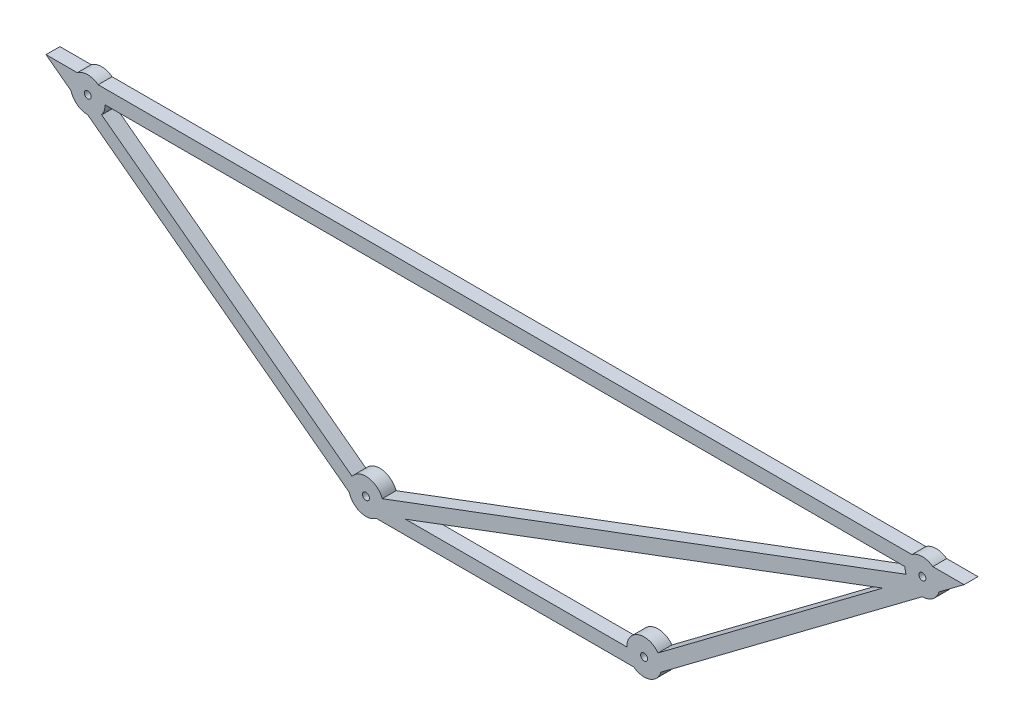
ISO-10303-21;
HEADER;
FILE_DESCRIPTION(('STEP AP214'),'2;1');
FILE_NAME('part.step','',(''),(''),'','','');
FILE_SCHEMA(('AUTOMOTIVE_DESIGN { 1 0 10303 214 1 1 1 1 }'));
ENDSEC;
DATA;
#1=APPLICATION_CONTEXT('core data for automotive mechanical design processes');
#2=APPLICATION_PROTOCOL_DEFINITION('international standard','automotive_design',2000,#1);
#3=PRODUCT_CONTEXT('',#1,'mechanical');
#4=PRODUCT('Part','Part','',(#3));
#5=PRODUCT_RELATED_PRODUCT_CATEGORY('part','',(#4));
#6=PRODUCT_DEFINITION_FORMATION('','',#4);
#7=PRODUCT_DEFINITION_CONTEXT('part definition',#1,'design');
#8=PRODUCT_DEFINITION('design','',#6,#7);
#9=PRODUCT_DEFINITION_SHAPE('','',#8);
#10=(LENGTH_UNIT() NAMED_UNIT(*) SI_UNIT(.MILLI.,.METRE.));
#11=(NAMED_UNIT(*) PLANE_ANGLE_UNIT() SI_UNIT($,.RADIAN.));
#12=(NAMED_UNIT(*) SI_UNIT($,.STERADIAN.) SOLID_ANGLE_UNIT());
#13=UNCERTAINTY_MEASURE_WITH_UNIT(LENGTH_MEASURE(1.E-05),#10,'distance_accuracy_value','');
#14=(GEOMETRIC_REPRESENTATION_CONTEXT(3) GLOBAL_UNCERTAINTY_ASSIGNED_CONTEXT((#13)) GLOBAL_UNIT_ASSIGNED_CONTEXT((#10,
#11,#12)) REPRESENTATION_CONTEXT('',''));
#15=CARTESIAN_POINT('',(0.,0.,0.));
#16=DIRECTION('',(0.,0.,1.));
#17=DIRECTION('',(1.,0.,0.));
#18=AXIS2_PLACEMENT_3D('',#15,#16,#17);
#19=CARTESIAN_POINT('',(0.,0.,0.));
#20=DIRECTION('',(0.,0.,-1.));
#21=DIRECTION('',(-1.,0.,0.));
#22=AXIS2_PLACEMENT_3D('',#19,#20,#21);
#23=PLANE('',#22);
#24=CARTESIAN_POINT('',(0.,0.,0.));
#25=DIRECTION('',(0.,0.,1.));
#26=DIRECTION('',(1.,0.,0.));
#27=AXIS2_PLACEMENT_3D('',#24,#25,#26);
#28=CIRCLE('',#27,5.);
#29=CARTESIAN_POINT('',(5.,0.,0.));
#30=VERTEX_POINT('',#29);
#31=EDGE_CURVE('E887',#30,#30,#28,.T.);
#32=ORIENTED_EDGE('',*,*,#31,.T.);
#33=EDGE_LOOP('',(#32));
#34=FACE_BOUND('',#33,.T.);
#35=CARTESIAN_POINT('',(400.,-300.,0.));
#36=DIRECTION('',(0.,0.,1.));
#37=DIRECTION('',(1.,0.,0.));
#38=AXIS2_PLACEMENT_3D('',#35,#36,#37);
#39=CIRCLE('',#38,4.99999999999999);
#40=CARTESIAN_POINT('',(405.,-300.,0.));
#41=VERTEX_POINT('',#40);
#42=EDGE_CURVE('E894',#41,#41,#39,.T.);
#43=ORIENTED_EDGE('',*,*,#42,.T.);
#44=EDGE_LOOP('',(#43));
#45=FACE_BOUND('',#44,.T.);
#46=CARTESIAN_POINT('',(800.,-300.,0.));
#47=DIRECTION('',(0.,0.,1.));
#48=DIRECTION('',(1.,0.,0.));
#49=AXIS2_PLACEMENT_3D('',#46,#47,#48);
#50=CIRCLE('',#49,5.00000000000005);
#51=CARTESIAN_POINT('',(805.,-300.,0.));
#52=VERTEX_POINT('',#51);
#53=EDGE_CURVE('E902',#52,#52,#50,.T.);
#54=ORIENTED_EDGE('',*,*,#53,.T.);
#55=EDGE_LOOP('',(#54));
#56=FACE_BOUND('',#55,.T.);
#57=CARTESIAN_POINT('',(1200.,0.,0.));
#58=DIRECTION('',(0.,0.,1.));
#59=DIRECTION('',(1.,0.,0.));
#60=AXIS2_PLACEMENT_3D('',#57,#58,#59);
#61=CIRCLE('',#60,4.99999999999982);
#62=CARTESIAN_POINT('',(1205.,0.,0.));
#63=VERTEX_POINT('',#62);
#64=EDGE_CURVE('E908',#63,#63,#61,.T.);
#65=ORIENTED_EDGE('',*,*,#64,.T.);
#66=EDGE_LOOP('',(#65));
#67=FACE_BOUND('',#66,.T.);
#68=DIRECTION('',(-1.,0.,0.));
#69=VECTOR('',#68,1.);
#70=CARTESIAN_POINT('',(0.,-300.,0.));
#71=LINE('',#70,#69);
#72=CARTESIAN_POINT('',(775.,-300.,0.));
#73=VERTEX_POINT('',#72);
#74=CARTESIAN_POINT('',(456.960024968783,-300.,0.));
#75=VERTEX_POINT('',#74);
#76=EDGE_CURVE('E650',#73,#75,#71,.T.);
#77=ORIENTED_EDGE('',*,*,#76,.F.);
#78=CARTESIAN_POINT('',(800.,-300.,0.));
#79=DIRECTION('',(0.,0.,1.));
#80=DIRECTION('',(1.,0.,0.));
#81=AXIS2_PLACEMENT_3D('',#78,#79,#80);
#82=CIRCLE('',#81,25.);
#83=CARTESIAN_POINT('',(820.,-285.,0.));
#84=VERTEX_POINT('',#83);
#85=EDGE_CURVE('E718',#84,#73,#82,.T.);
#86=ORIENTED_EDGE('',*,*,#85,.F.);
#87=DIRECTION('',(-0.799999999999999,-0.600000000000001,0.));
#88=VECTOR('',#87,1.);
#89=CARTESIAN_POINT('',(432.000000000001,-576.,0.));
#90=LINE('',#89,#88);
#91=CARTESIAN_POINT('',(1143.03997503121,-42.7200187265881,0.));
#92=VERTEX_POINT('',#91);
#93=EDGE_CURVE('E645',#92,#84,#90,.T.);
#94=ORIENTED_EDGE('',*,*,#93,.F.);
#95=DIRECTION('',(0.936329177569044,0.351123441588392,0.));
#96=VECTOR('',#95,1.);
#97=CARTESIAN_POINT('',(407.022468831768,-318.726583551381,0.));
#98=LINE('',#97,#96);
#99=EDGE_CURVE('E610',#75,#92,#98,.T.);
#100=ORIENTED_EDGE('',*,*,#99,.F.);
#101=EDGE_LOOP('',(#77,#86,#94,#100));
#102=FACE_BOUND('',#101,.T.);
#103=DIRECTION('',(-0.8,0.6,0.));
#104=VECTOR('',#103,1.);
#105=CARTESIAN_POINT('',(0.,0.,0.));
#106=LINE('',#105,#104);
#107=CARTESIAN_POINT('',(380.,-285.,0.));
#108=VERTEX_POINT('',#107);
#109=CARTESIAN_POINT('',(20.,-15.,0.));
#110=VERTEX_POINT('',#109);
#111=EDGE_CURVE('E647',#108,#110,#106,.T.);
#112=ORIENTED_EDGE('',*,*,#111,.F.);
#113=CARTESIAN_POINT('',(400.,-300.,0.));
#114=DIRECTION('',(0.,0.,1.));
#115=DIRECTION('',(1.,0.,0.));
#116=AXIS2_PLACEMENT_3D('',#113,#114,#115);
#117=CIRCLE('',#116,25.);
#118=CARTESIAN_POINT('',(423.408229439226,-291.22191396029,0.));
#119=VERTEX_POINT('',#118);
#120=EDGE_CURVE('E713',#119,#108,#117,.T.);
#121=ORIENTED_EDGE('',*,*,#120,.F.);
#122=DIRECTION('',(0.936329177569044,0.351123441588392,0.));
#123=VECTOR('',#122,1.);
#124=CARTESIAN_POINT('',(400.,-300.,0.));
#125=LINE('',#124,#123);
#126=CARTESIAN_POINT('',(1176.59177056077,-8.77808603970974,0.));
#127=VERTEX_POINT('',#126);
#128=EDGE_CURVE('E627',#119,#127,#125,.T.);
#129=ORIENTED_EDGE('',*,*,#128,.T.);
#130=CARTESIAN_POINT('',(1200.,0.,0.));
#131=DIRECTION('',(0.,0.,1.));
#132=DIRECTION('',(1.,0.,0.));
#133=AXIS2_PLACEMENT_3D('',#130,#131,#132);
#134=CIRCLE('',#133,24.9999999999998);
#135=CARTESIAN_POINT('',(1175.,0.,0.));
#136=VERTEX_POINT('',#135);
#137=EDGE_CURVE('E735',#136,#127,#134,.T.);
#138=ORIENTED_EDGE('',*,*,#137,.F.);
#139=DIRECTION('',(1.,0.,0.));
#140=VECTOR('',#139,1.);
#141=CARTESIAN_POINT('',(0.,0.,0.));
#142=LINE('',#141,#140);
#143=CARTESIAN_POINT('',(25.,0.,0.));
#144=VERTEX_POINT('',#143);
#145=EDGE_CURVE('E653',#144,#136,#142,.T.);
#146=ORIENTED_EDGE('',*,*,#145,.F.);
#147=CARTESIAN_POINT('',(0.,0.,0.));
#148=DIRECTION('',(0.,0.,1.));
#149=DIRECTION('',(1.,0.,0.));
#150=AXIS2_PLACEMENT_3D('',#147,#148,#149);
#151=CIRCLE('',#150,25.);
#152=EDGE_CURVE('E710',#110,#144,#151,.T.);
#153=ORIENTED_EDGE('',*,*,#152,.F.);
#154=EDGE_LOOP('',(#112,#121,#129,#138,#146,#153));
#155=FACE_BOUND('',#154,.T.);
#156=CARTESIAN_POINT('',(785.,-320.,0.));
#157=VERTEX_POINT('',#156);
#158=CARTESIAN_POINT('',(824.,-307.,0.));
#159=VERTEX_POINT('',#158);
#160=EDGE_CURVE('E722',#157,#159,#82,.T.);
#161=ORIENTED_EDGE('',*,*,#160,.F.);
#162=DIRECTION('',(-1.,0.,0.));
#163=VECTOR('',#162,1.);
#164=CARTESIAN_POINT('',(0.,-320.,0.));
#165=LINE('',#164,#163);
#166=CARTESIAN_POINT('',(415.,-320.,0.));
#167=VERTEX_POINT('',#166);
#168=EDGE_CURVE('E617',#157,#167,#165,.T.);
#169=ORIENTED_EDGE('',*,*,#168,.T.);
#170=CARTESIAN_POINT('',(376.,-307.,0.));
#171=VERTEX_POINT('',#170);
#172=EDGE_CURVE('E717',#171,#167,#117,.T.);
#173=ORIENTED_EDGE('',*,*,#172,.F.);
#174=DIRECTION('',(-0.8,0.6,0.));
#175=VECTOR('',#174,1.);
#176=CARTESIAN_POINT('',(-12.,-16.,0.));
#177=LINE('',#176,#175);
#178=CARTESIAN_POINT('',(0.,-25.,0.));
#179=VERTEX_POINT('',#178);
#180=EDGE_CURVE('E676',#171,#179,#177,.T.);
#181=ORIENTED_EDGE('',*,*,#180,.T.);
#182=CARTESIAN_POINT('',(-24.,-7.,0.));
#183=VERTEX_POINT('',#182);
#184=EDGE_CURVE('E709',#183,#179,#151,.T.);
#185=ORIENTED_EDGE('',*,*,#184,.F.);
#186=CARTESIAN_POINT('',(-60.,20.,0.));
#187=VERTEX_POINT('',#186);
#188=EDGE_CURVE('E677',#183,#187,#177,.T.);
#189=ORIENTED_EDGE('',*,*,#188,.T.);
#190=DIRECTION('',(1.,0.,0.));
#191=VECTOR('',#190,1.);
#192=CARTESIAN_POINT('',(0.,20.,0.));
#193=LINE('',#192,#191);
#194=CARTESIAN_POINT('',(-15.,20.,0.));
#195=VERTEX_POINT('',#194);
#196=EDGE_CURVE('E679',#187,#195,#193,.T.);
#197=ORIENTED_EDGE('',*,*,#196,.T.);
#198=CARTESIAN_POINT('',(15.,20.,0.));
#199=VERTEX_POINT('',#198);
#200=EDGE_CURVE('E706',#199,#195,#151,.T.);
#201=ORIENTED_EDGE('',*,*,#200,.F.);
#202=CARTESIAN_POINT('',(1185.,20.,0.));
#203=VERTEX_POINT('',#202);
#204=EDGE_CURVE('E682',#199,#203,#193,.T.);
#205=ORIENTED_EDGE('',*,*,#204,.T.);
#206=CARTESIAN_POINT('',(1215.,20.,0.));
#207=VERTEX_POINT('',#206);
#208=EDGE_CURVE('E727',#207,#203,#134,.T.);
#209=ORIENTED_EDGE('',*,*,#208,.F.);
#210=CARTESIAN_POINT('',(1260.,20.,0.));
#211=VERTEX_POINT('',#210);
#212=EDGE_CURVE('E685',#207,#211,#193,.T.);
#213=ORIENTED_EDGE('',*,*,#212,.T.);
#214=DIRECTION('',(-0.799999999999999,-0.600000000000001,0.));
#215=VECTOR('',#214,1.);
#216=CARTESIAN_POINT('',(444.000000000001,-592.,0.));
#217=LINE('',#216,#215);
#218=CARTESIAN_POINT('',(1224.,-7.00000000000001,0.));
#219=VERTEX_POINT('',#218);
#220=EDGE_CURVE('E662',#211,#219,#217,.T.);
#221=ORIENTED_EDGE('',*,*,#220,.T.);
#222=CARTESIAN_POINT('',(1200.,-24.9999999999998,0.));
#223=VERTEX_POINT('',#222);
#224=EDGE_CURVE('E731',#223,#219,#134,.T.);
#225=ORIENTED_EDGE('',*,*,#224,.F.);
#226=EDGE_CURVE('E684',#223,#159,#217,.T.);
#227=ORIENTED_EDGE('',*,*,#226,.T.);
#228=EDGE_LOOP('',(#161,#169,#173,#181,#185,#189,#197,#201,#205,#209,#213,#221,#225,#227));
#229=FACE_BOUND('',#228,.T.);
#230=ADVANCED_FACE('F434',(#34,#45,#56,#67,#102,#155,#229),#23,.T.);
#231=CARTESIAN_POINT('',(0.,0.,20.));
#232=DIRECTION('',(0.,0.,-1.));
#233=DIRECTION('',(-1.,0.,0.));
#234=AXIS2_PLACEMENT_3D('',#231,#232,#233);
#235=PLANE('',#234);
#236=CARTESIAN_POINT('',(0.,0.,20.));
#237=DIRECTION('',(0.,0.,1.));
#238=DIRECTION('',(1.,0.,0.));
#239=AXIS2_PLACEMENT_3D('',#236,#237,#238);
#240=CIRCLE('',#239,5.);
#241=CARTESIAN_POINT('',(5.,0.,20.));
#242=VERTEX_POINT('',#241);
#243=EDGE_CURVE('E886',#242,#242,#240,.T.);
#244=ORIENTED_EDGE('',*,*,#243,.F.);
#245=EDGE_LOOP('',(#244));
#246=FACE_BOUND('',#245,.T.);
#247=CARTESIAN_POINT('',(400.,-300.,20.));
#248=DIRECTION('',(0.,0.,1.));
#249=DIRECTION('',(1.,0.,0.));
#250=AXIS2_PLACEMENT_3D('',#247,#248,#249);
#251=CIRCLE('',#250,4.99999999999999);
#252=CARTESIAN_POINT('',(405.,-300.,20.));
#253=VERTEX_POINT('',#252);
#254=EDGE_CURVE('E898',#253,#253,#251,.T.);
#255=ORIENTED_EDGE('',*,*,#254,.F.);
#256=EDGE_LOOP('',(#255));
#257=FACE_BOUND('',#256,.T.);
#258=CARTESIAN_POINT('',(800.,-300.,20.));
#259=DIRECTION('',(0.,0.,1.));
#260=DIRECTION('',(1.,0.,0.));
#261=AXIS2_PLACEMENT_3D('',#258,#259,#260);
#262=CIRCLE('',#261,5.00000000000005);
#263=CARTESIAN_POINT('',(805.,-300.,20.));
#264=VERTEX_POINT('',#263);
#265=EDGE_CURVE('E906',#264,#264,#262,.T.);
#266=ORIENTED_EDGE('',*,*,#265,.F.);
#267=EDGE_LOOP('',(#266));
#268=FACE_BOUND('',#267,.T.);
#269=CARTESIAN_POINT('',(1200.,0.,20.));
#270=DIRECTION('',(0.,0.,1.));
#271=DIRECTION('',(1.,0.,0.));
#272=AXIS2_PLACEMENT_3D('',#269,#270,#271);
#273=CIRCLE('',#272,4.99999999999982);
#274=CARTESIAN_POINT('',(1205.,0.,20.));
#275=VERTEX_POINT('',#274);
#276=EDGE_CURVE('E634',#275,#275,#273,.T.);
#277=ORIENTED_EDGE('',*,*,#276,.F.);
#278=EDGE_LOOP('',(#277));
#279=FACE_BOUND('',#278,.T.);
#280=CARTESIAN_POINT('',(800.,-300.,20.));
#281=DIRECTION('',(0.,0.,1.));
#282=DIRECTION('',(1.,0.,0.));
#283=AXIS2_PLACEMENT_3D('',#280,#281,#282);
#284=CIRCLE('',#283,25.);
#285=CARTESIAN_POINT('',(820.,-285.,20.));
#286=VERTEX_POINT('',#285);
#287=CARTESIAN_POINT('',(775.,-300.,20.));
#288=VERTEX_POINT('',#287);
#289=EDGE_CURVE('E720',#286,#288,#284,.T.);
#290=ORIENTED_EDGE('',*,*,#289,.T.);
#291=DIRECTION('',(-1.,0.,0.));
#292=VECTOR('',#291,1.);
#293=CARTESIAN_POINT('',(0.,-300.,20.));
#294=LINE('',#293,#292);
#295=CARTESIAN_POINT('',(456.960024968783,-300.,20.));
#296=VERTEX_POINT('',#295);
#297=EDGE_CURVE('E628',#288,#296,#294,.T.);
#298=ORIENTED_EDGE('',*,*,#297,.T.);
#299=DIRECTION('',(0.936329177569044,0.351123441588392,0.));
#300=VECTOR('',#299,1.);
#301=CARTESIAN_POINT('',(407.022468831768,-318.726583551381,20.));
#302=LINE('',#301,#300);
#303=CARTESIAN_POINT('',(1143.03997503121,-42.7200187265881,20.));
#304=VERTEX_POINT('',#303);
#305=EDGE_CURVE('E604',#296,#304,#302,.T.);
#306=ORIENTED_EDGE('',*,*,#305,.T.);
#307=DIRECTION('',(-0.799999999999999,-0.600000000000001,0.));
#308=VECTOR('',#307,1.);
#309=CARTESIAN_POINT('',(432.000000000001,-576.,20.));
#310=LINE('',#309,#308);
#311=EDGE_CURVE('E614',#304,#286,#310,.T.);
#312=ORIENTED_EDGE('',*,*,#311,.T.);
#313=EDGE_LOOP('',(#290,#298,#306,#312));
#314=FACE_BOUND('',#313,.T.);
#315=CARTESIAN_POINT('',(400.,-300.,20.));
#316=DIRECTION('',(0.,0.,1.));
#317=DIRECTION('',(1.,0.,0.));
#318=AXIS2_PLACEMENT_3D('',#315,#316,#317);
#319=CIRCLE('',#318,25.);
#320=CARTESIAN_POINT('',(423.408229439226,-291.22191396029,20.));
#321=VERTEX_POINT('',#320);
#322=CARTESIAN_POINT('',(380.,-285.,20.));
#323=VERTEX_POINT('',#322);
#324=EDGE_CURVE('E711',#321,#323,#319,.T.);
#325=ORIENTED_EDGE('',*,*,#324,.T.);
#326=DIRECTION('',(-0.8,0.6,0.));
#327=VECTOR('',#326,1.);
#328=CARTESIAN_POINT('',(0.,0.,20.));
#329=LINE('',#328,#327);
#330=CARTESIAN_POINT('',(20.,-15.,20.));
#331=VERTEX_POINT('',#330);
#332=EDGE_CURVE('E643',#323,#331,#329,.T.);
#333=ORIENTED_EDGE('',*,*,#332,.T.);
#334=CARTESIAN_POINT('',(0.,0.,20.));
#335=DIRECTION('',(0.,0.,1.));
#336=DIRECTION('',(1.,0.,0.));
#337=AXIS2_PLACEMENT_3D('',#334,#335,#336);
#338=CIRCLE('',#337,25.);
#339=CARTESIAN_POINT('',(25.,0.,20.));
#340=VERTEX_POINT('',#339);
#341=EDGE_CURVE('E705',#331,#340,#338,.T.);
#342=ORIENTED_EDGE('',*,*,#341,.T.);
#343=DIRECTION('',(1.,0.,0.));
#344=VECTOR('',#343,1.);
#345=CARTESIAN_POINT('',(0.,0.,20.));
#346=LINE('',#345,#344);
#347=CARTESIAN_POINT('',(1175.,0.,20.));
#348=VERTEX_POINT('',#347);
#349=EDGE_CURVE('E619',#340,#348,#346,.T.);
#350=ORIENTED_EDGE('',*,*,#349,.T.);
#351=CARTESIAN_POINT('',(1200.,0.,20.));
#352=DIRECTION('',(0.,0.,1.));
#353=DIRECTION('',(1.,0.,0.));
#354=AXIS2_PLACEMENT_3D('',#351,#352,#353);
#355=CIRCLE('',#354,24.9999999999998);
#356=CARTESIAN_POINT('',(1176.59177056077,-8.77808603970974,20.));
#357=VERTEX_POINT('',#356);
#358=EDGE_CURVE('E730',#348,#357,#355,.T.);
#359=ORIENTED_EDGE('',*,*,#358,.T.);
#360=DIRECTION('',(0.936329177569044,0.351123441588392,0.));
#361=VECTOR('',#360,1.);
#362=CARTESIAN_POINT('',(400.,-300.,20.));
#363=LINE('',#362,#361);
#364=EDGE_CURVE('E629',#321,#357,#363,.T.);
#365=ORIENTED_EDGE('',*,*,#364,.F.);
#366=EDGE_LOOP('',(#325,#333,#342,#350,#359,#365));
#367=FACE_BOUND('',#366,.T.);
#368=DIRECTION('',(-1.,0.,0.));
#369=VECTOR('',#368,1.);
#370=CARTESIAN_POINT('',(0.,-320.,20.));
#371=LINE('',#370,#369);
#372=CARTESIAN_POINT('',(785.,-320.,20.));
#373=VERTEX_POINT('',#372);
#374=CARTESIAN_POINT('',(415.,-320.,20.));
#375=VERTEX_POINT('',#374);
#376=EDGE_CURVE('E660',#373,#375,#371,.T.);
#377=ORIENTED_EDGE('',*,*,#376,.F.);
#378=CARTESIAN_POINT('',(824.,-307.,20.));
#379=VERTEX_POINT('',#378);
#380=EDGE_CURVE('E716',#373,#379,#284,.T.);
#381=ORIENTED_EDGE('',*,*,#380,.T.);
#382=DIRECTION('',(-0.799999999999999,-0.600000000000001,0.));
#383=VECTOR('',#382,1.);
#384=CARTESIAN_POINT('',(444.000000000001,-592.,20.));
#385=LINE('',#384,#383);
#386=CARTESIAN_POINT('',(1200.,-24.9999999999998,20.));
#387=VERTEX_POINT('',#386);
#388=EDGE_CURVE('E669',#387,#379,#385,.T.);
#389=ORIENTED_EDGE('',*,*,#388,.F.);
#390=CARTESIAN_POINT('',(1224.,-7.00000000000001,20.));
#391=VERTEX_POINT('',#390);
#392=EDGE_CURVE('E728',#387,#391,#355,.T.);
#393=ORIENTED_EDGE('',*,*,#392,.T.);
#394=CARTESIAN_POINT('',(1260.,20.,20.));
#395=VERTEX_POINT('',#394);
#396=EDGE_CURVE('E666',#395,#391,#385,.T.);
#397=ORIENTED_EDGE('',*,*,#396,.F.);
#398=DIRECTION('',(1.,0.,0.));
#399=VECTOR('',#398,1.);
#400=CARTESIAN_POINT('',(0.,20.,20.));
#401=LINE('',#400,#399);
#402=CARTESIAN_POINT('',(1215.,20.,20.));
#403=VERTEX_POINT('',#402);
#404=EDGE_CURVE('E670',#403,#395,#401,.T.);
#405=ORIENTED_EDGE('',*,*,#404,.F.);
#406=CARTESIAN_POINT('',(1185.,20.,20.));
#407=VERTEX_POINT('',#406);
#408=EDGE_CURVE('E725',#403,#407,#355,.T.);
#409=ORIENTED_EDGE('',*,*,#408,.T.);
#410=CARTESIAN_POINT('',(15.,20.,20.));
#411=VERTEX_POINT('',#410);
#412=EDGE_CURVE('E667',#411,#407,#401,.T.);
#413=ORIENTED_EDGE('',*,*,#412,.F.);
#414=CARTESIAN_POINT('',(-15.,20.,20.));
#415=VERTEX_POINT('',#414);
#416=EDGE_CURVE('E649',#411,#415,#338,.T.);
#417=ORIENTED_EDGE('',*,*,#416,.T.);
#418=CARTESIAN_POINT('',(-60.,20.,20.));
#419=VERTEX_POINT('',#418);
#420=EDGE_CURVE('E661',#419,#415,#401,.T.);
#421=ORIENTED_EDGE('',*,*,#420,.F.);
#422=DIRECTION('',(-0.8,0.6,0.));
#423=VECTOR('',#422,1.);
#424=CARTESIAN_POINT('',(-12.,-16.,20.));
#425=LINE('',#424,#423);
#426=CARTESIAN_POINT('',(-24.,-7.,20.));
#427=VERTEX_POINT('',#426);
#428=EDGE_CURVE('E659',#427,#419,#425,.T.);
#429=ORIENTED_EDGE('',*,*,#428,.F.);
#430=CARTESIAN_POINT('',(0.,-25.,20.));
#431=VERTEX_POINT('',#430);
#432=EDGE_CURVE('E704',#427,#431,#338,.T.);
#433=ORIENTED_EDGE('',*,*,#432,.T.);
#434=CARTESIAN_POINT('',(376.,-307.,20.));
#435=VERTEX_POINT('',#434);
#436=EDGE_CURVE('E664',#435,#431,#425,.T.);
#437=ORIENTED_EDGE('',*,*,#436,.F.);
#438=EDGE_CURVE('E712',#435,#375,#319,.T.);
#439=ORIENTED_EDGE('',*,*,#438,.T.);
#440=EDGE_LOOP('',(#377,#381,#389,#393,#397,#405,#409,#413,#417,#421,#429,#433,#437,#439));
#441=FACE_BOUND('',#440,.T.);
#442=ADVANCED_FACE('F621',(#246,#257,#268,#279,#314,#367,#441),#235,.F.);
#443=CARTESIAN_POINT('',(407.022468831768,-318.726583551381,20.));
#444=DIRECTION('',(-0.351123441588392,0.936329177569044,0.));
#445=DIRECTION('',(-0.936329177569044,-0.351123441588392,0.));
#446=AXIS2_PLACEMENT_3D('',#443,#444,#445);
#447=PLANE('',#446);
#448=DIRECTION('',(0.,0.,1.));
#449=VECTOR('',#448,1.);
#450=CARTESIAN_POINT('',(456.960024968784,-300.,20.));
#451=LINE('',#450,#449);
#452=EDGE_CURVE('E12',#75,#296,#451,.T.);
#453=ORIENTED_EDGE('',*,*,#452,.F.);
#454=ORIENTED_EDGE('',*,*,#99,.T.);
#455=DIRECTION('',(0.,0.,-1.));
#456=VECTOR('',#455,1.);
#457=CARTESIAN_POINT('',(1143.03997503122,-42.7200187265879,20.));
#458=LINE('',#457,#456);
#459=EDGE_CURVE('E443',#304,#92,#458,.T.);
#460=ORIENTED_EDGE('',*,*,#459,.F.);
#461=ORIENTED_EDGE('',*,*,#305,.F.);
#462=EDGE_LOOP('',(#453,#454,#460,#461));
#463=FACE_BOUND('',#462,.T.);
#464=ADVANCED_FACE('F602',(#463),#447,.F.);
#465=CARTESIAN_POINT('',(400.,-300.,20.));
#466=DIRECTION('',(-0.351123441588392,0.936329177569044,0.));
#467=DIRECTION('',(-0.936329177569044,-0.351123441588392,0.));
#468=AXIS2_PLACEMENT_3D('',#465,#466,#467);
#469=PLANE('',#468);
#470=ORIENTED_EDGE('',*,*,#128,.F.);
#471=DIRECTION('',(0.,0.,-1.));
#472=VECTOR('',#471,1.);
#473=CARTESIAN_POINT('',(423.408229439226,-291.22191396029,20.));
#474=LINE('',#473,#472);
#475=EDGE_CURVE('E438',#119,#321,#474,.F.);
#476=ORIENTED_EDGE('',*,*,#475,.T.);
#477=ORIENTED_EDGE('',*,*,#364,.T.);
#478=DIRECTION('',(0.,0.,-1.));
#479=VECTOR('',#478,1.);
#480=CARTESIAN_POINT('',(1176.59177056077,-8.77808603970979,20.));
#481=LINE('',#480,#479);
#482=EDGE_CURVE('E453',#357,#127,#481,.T.);
#483=ORIENTED_EDGE('',*,*,#482,.T.);
#484=EDGE_LOOP('',(#470,#476,#477,#483));
#485=FACE_BOUND('',#484,.T.);
#486=ADVANCED_FACE('F759',(#485),#469,.T.);
#487=CARTESIAN_POINT('',(-12.,-16.,20.));
#488=DIRECTION('',(-0.6,-0.8,0.));
#489=DIRECTION('',(0.8,-0.6,0.));
#490=AXIS2_PLACEMENT_3D('',#487,#488,#489);
#491=PLANE('',#490);
#492=ORIENTED_EDGE('',*,*,#188,.F.);
#493=DIRECTION('',(0.,0.,-1.));
#494=VECTOR('',#493,1.);
#495=CARTESIAN_POINT('',(-24.,-7.,20.));
#496=LINE('',#495,#494);
#497=EDGE_CURVE('E585',#183,#427,#496,.F.);
#498=ORIENTED_EDGE('',*,*,#497,.T.);
#499=ORIENTED_EDGE('',*,*,#428,.T.);
#500=DIRECTION('',(0.,0.,-1.));
#501=VECTOR('',#500,1.);
#502=CARTESIAN_POINT('',(-60.,20.,20.));
#503=LINE('',#502,#501);
#504=EDGE_CURVE('E673',#419,#187,#503,.T.);
#505=ORIENTED_EDGE('',*,*,#504,.T.);
#506=EDGE_LOOP('',(#492,#498,#499,#505));
#507=FACE_BOUND('',#506,.T.);
#508=ADVANCED_FACE('F808',(#507),#491,.T.);
#509=CARTESIAN_POINT('',(0.,20.,20.));
#510=DIRECTION('',(0.,1.,0.));
#511=DIRECTION('',(0.,0.,1.));
#512=AXIS2_PLACEMENT_3D('',#509,#510,#511);
#513=PLANE('',#512);
#514=ORIENTED_EDGE('',*,*,#420,.T.);
#515=DIRECTION('',(0.,0.,-1.));
#516=VECTOR('',#515,1.);
#517=CARTESIAN_POINT('',(-15.,20.,20.));
#518=LINE('',#517,#516);
#519=EDGE_CURVE('E745',#415,#195,#518,.T.);
#520=ORIENTED_EDGE('',*,*,#519,.T.);
#521=ORIENTED_EDGE('',*,*,#196,.F.);
#522=ORIENTED_EDGE('',*,*,#504,.F.);
#523=EDGE_LOOP('',(#514,#520,#521,#522));
#524=FACE_BOUND('',#523,.T.);
#525=ADVANCED_FACE('F801',(#524),#513,.T.);
#526=CARTESIAN_POINT('',(0.,0.,20.));
#527=DIRECTION('',(0.,0.,-1.));
#528=DIRECTION('',(-1.,0.,0.));
#529=AXIS2_PLACEMENT_3D('',#526,#527,#528);
#530=CYLINDRICAL_SURFACE('',#529,25.);
#531=ORIENTED_EDGE('',*,*,#497,.F.);
#532=ORIENTED_EDGE('',*,*,#184,.T.);
#533=DIRECTION('',(0.,0.,-1.));
#534=VECTOR('',#533,1.);
#535=CARTESIAN_POINT('',(0.,-25.,20.));
#536=LINE('',#535,#534);
#537=EDGE_CURVE('E578',#431,#179,#536,.T.);
#538=ORIENTED_EDGE('',*,*,#537,.F.);
#539=ORIENTED_EDGE('',*,*,#432,.F.);
#540=EDGE_LOOP('',(#531,#532,#538,#539));
#541=FACE_BOUND('',#540,.T.);
#542=ADVANCED_FACE('F867',(#541),#530,.T.);
#543=DIRECTION('',(0.,0.,-1.));
#544=VECTOR('',#543,1.);
#545=CARTESIAN_POINT('',(15.,20.,20.));
#546=LINE('',#545,#544);
#547=EDGE_CURVE('E742',#199,#411,#546,.F.);
#548=ORIENTED_EDGE('',*,*,#547,.F.);
#549=ORIENTED_EDGE('',*,*,#200,.T.);
#550=ORIENTED_EDGE('',*,*,#519,.F.);
#551=ORIENTED_EDGE('',*,*,#416,.F.);
#552=EDGE_LOOP('',(#548,#549,#550,#551));
#553=FACE_BOUND('',#552,.T.);
#554=ADVANCED_FACE('F813',(#553),#530,.T.);
#555=ORIENTED_EDGE('',*,*,#152,.T.);
#556=DIRECTION('',(0.,0.,-1.));
#557=VECTOR('',#556,1.);
#558=CARTESIAN_POINT('',(25.,0.,20.));
#559=LINE('',#558,#557);
#560=EDGE_CURVE('E699',#144,#340,#559,.F.);
#561=ORIENTED_EDGE('',*,*,#560,.T.);
#562=ORIENTED_EDGE('',*,*,#341,.F.);
#563=DIRECTION('',(0.,0.,-1.));
#564=VECTOR('',#563,1.);
#565=CARTESIAN_POINT('',(20.,-15.,20.));
#566=LINE('',#565,#564);
#567=EDGE_CURVE('E694',#331,#110,#566,.T.);
#568=ORIENTED_EDGE('',*,*,#567,.T.);
#569=EDGE_LOOP('',(#555,#561,#562,#568));
#570=FACE_BOUND('',#569,.T.);
#571=ADVANCED_FACE('F875',(#570),#530,.T.);
#572=ORIENTED_EDGE('',*,*,#436,.T.);
#573=ORIENTED_EDGE('',*,*,#537,.T.);
#574=ORIENTED_EDGE('',*,*,#180,.F.);
#575=DIRECTION('',(0.,0.,-1.));
#576=VECTOR('',#575,1.);
#577=CARTESIAN_POINT('',(376.,-307.,20.));
#578=LINE('',#577,#576);
#579=EDGE_CURVE('E734',#171,#435,#578,.F.);
#580=ORIENTED_EDGE('',*,*,#579,.T.);
#581=EDGE_LOOP('',(#572,#573,#574,#580));
#582=FACE_BOUND('',#581,.T.);
#583=ADVANCED_FACE('F793',(#582),#491,.T.);
#584=CARTESIAN_POINT('',(400.,-300.,20.));
#585=DIRECTION('',(0.,0.,-1.));
#586=DIRECTION('',(-1.,0.,0.));
#587=AXIS2_PLACEMENT_3D('',#584,#585,#586);
#588=CYLINDRICAL_SURFACE('',#587,25.);
#589=DIRECTION('',(0.,0.,-1.));
#590=VECTOR('',#589,1.);
#591=CARTESIAN_POINT('',(415.,-320.,20.));
#592=LINE('',#591,#590);
#593=EDGE_CURVE('E636',#375,#167,#592,.T.);
#594=ORIENTED_EDGE('',*,*,#593,.F.);
#595=ORIENTED_EDGE('',*,*,#438,.F.);
#596=ORIENTED_EDGE('',*,*,#579,.F.);
#597=ORIENTED_EDGE('',*,*,#172,.T.);
#598=EDGE_LOOP('',(#594,#595,#596,#597));
#599=FACE_BOUND('',#598,.T.);
#600=ADVANCED_FACE('F873',(#599),#588,.T.);
#601=ORIENTED_EDGE('',*,*,#212,.F.);
#602=DIRECTION('',(0.,0.,-1.));
#603=VECTOR('',#602,1.);
#604=CARTESIAN_POINT('',(1215.,20.,20.));
#605=LINE('',#604,#603);
#606=EDGE_CURVE('E744',#207,#403,#605,.F.);
#607=ORIENTED_EDGE('',*,*,#606,.T.);
#608=ORIENTED_EDGE('',*,*,#404,.T.);
#609=DIRECTION('',(0.,0.,-1.));
#610=VECTOR('',#609,1.);
#611=CARTESIAN_POINT('',(1260.,20.,20.));
#612=LINE('',#611,#610);
#613=EDGE_CURVE('E690',#395,#211,#612,.T.);
#614=ORIENTED_EDGE('',*,*,#613,.T.);
#615=EDGE_LOOP('',(#601,#607,#608,#614));
#616=FACE_BOUND('',#615,.T.);
#617=ADVANCED_FACE('F784',(#616),#513,.T.);
#618=CARTESIAN_POINT('',(444.000000000001,-592.,20.));
#619=DIRECTION('',(0.600000000000001,-0.799999999999999,0.));
#620=DIRECTION('',(0.799999999999999,0.600000000000001,0.));
#621=AXIS2_PLACEMENT_3D('',#618,#619,#620);
#622=PLANE('',#621);
#623=ORIENTED_EDGE('',*,*,#396,.T.);
#624=DIRECTION('',(0.,0.,-1.));
#625=VECTOR('',#624,1.);
#626=CARTESIAN_POINT('',(1224.,-7.00000000000003,20.));
#627=LINE('',#626,#625);
#628=EDGE_CURVE('E747',#391,#219,#627,.T.);
#629=ORIENTED_EDGE('',*,*,#628,.T.);
#630=ORIENTED_EDGE('',*,*,#220,.F.);
#631=ORIENTED_EDGE('',*,*,#613,.F.);
#632=EDGE_LOOP('',(#623,#629,#630,#631));
#633=FACE_BOUND('',#632,.T.);
#634=ADVANCED_FACE('F776',(#633),#622,.T.);
#635=CARTESIAN_POINT('',(1200.,0.,20.));
#636=DIRECTION('',(0.,0.,-1.));
#637=DIRECTION('',(-1.,0.,0.));
#638=AXIS2_PLACEMENT_3D('',#635,#636,#637);
#639=CYLINDRICAL_SURFACE('',#638,24.9999999999998);
#640=ORIENTED_EDGE('',*,*,#606,.F.);
#641=ORIENTED_EDGE('',*,*,#208,.T.);
#642=DIRECTION('',(0.,0.,-1.));
#643=VECTOR('',#642,1.);
#644=CARTESIAN_POINT('',(1185.,20.,20.));
#645=LINE('',#644,#643);
#646=EDGE_CURVE('E741',#407,#203,#645,.T.);
#647=ORIENTED_EDGE('',*,*,#646,.F.);
#648=ORIENTED_EDGE('',*,*,#408,.F.);
#649=EDGE_LOOP('',(#640,#641,#647,#648));
#650=FACE_BOUND('',#649,.T.);
#651=ADVANCED_FACE('F440',(#650),#639,.T.);
#652=ORIENTED_EDGE('',*,*,#204,.F.);
#653=ORIENTED_EDGE('',*,*,#547,.T.);
#654=ORIENTED_EDGE('',*,*,#412,.T.);
#655=ORIENTED_EDGE('',*,*,#646,.T.);
#656=EDGE_LOOP('',(#652,#653,#654,#655));
#657=FACE_BOUND('',#656,.T.);
#658=ADVANCED_FACE('F818',(#657),#513,.T.);
#659=DIRECTION('',(0.,0.,-1.));
#660=VECTOR('',#659,1.);
#661=CARTESIAN_POINT('',(1200.,-24.9999999999998,20.));
#662=LINE('',#661,#660);
#663=EDGE_CURVE('E753',#223,#387,#662,.F.);
#664=ORIENTED_EDGE('',*,*,#663,.F.);
#665=ORIENTED_EDGE('',*,*,#224,.T.);
#666=ORIENTED_EDGE('',*,*,#628,.F.);
#667=ORIENTED_EDGE('',*,*,#392,.F.);
#668=EDGE_LOOP('',(#664,#665,#666,#667));
#669=FACE_BOUND('',#668,.T.);
#670=ADVANCED_FACE('F825',(#669),#639,.T.);
#671=CARTESIAN_POINT('',(800.,-300.,20.));
#672=DIRECTION('',(0.,0.,-1.));
#673=DIRECTION('',(-1.,0.,0.));
#674=AXIS2_PLACEMENT_3D('',#671,#672,#673);
#675=CYLINDRICAL_SURFACE('',#674,25.);
#676=DIRECTION('',(0.,0.,-1.));
#677=VECTOR('',#676,1.);
#678=CARTESIAN_POINT('',(785.,-320.,20.));
#679=LINE('',#678,#677);
#680=EDGE_CURVE('E739',#157,#373,#679,.F.);
#681=ORIENTED_EDGE('',*,*,#680,.F.);
#682=ORIENTED_EDGE('',*,*,#160,.T.);
#683=DIRECTION('',(0.,0.,-1.));
#684=VECTOR('',#683,1.);
#685=CARTESIAN_POINT('',(824.,-307.,20.));
#686=LINE('',#685,#684);
#687=EDGE_CURVE('E751',#379,#159,#686,.T.);
#688=ORIENTED_EDGE('',*,*,#687,.F.);
#689=ORIENTED_EDGE('',*,*,#380,.F.);
#690=EDGE_LOOP('',(#681,#682,#688,#689));
#691=FACE_BOUND('',#690,.T.);
#692=ADVANCED_FACE('F834',(#691),#675,.T.);
#693=ORIENTED_EDGE('',*,*,#85,.T.);
#694=DIRECTION('',(0.,0.,-1.));
#695=VECTOR('',#694,1.);
#696=CARTESIAN_POINT('',(775.,-300.,20.));
#697=LINE('',#696,#695);
#698=EDGE_CURVE('E701',#73,#288,#697,.F.);
#699=ORIENTED_EDGE('',*,*,#698,.T.);
#700=ORIENTED_EDGE('',*,*,#289,.F.);
#701=DIRECTION('',(0.,0.,-1.));
#702=VECTOR('',#701,1.);
#703=CARTESIAN_POINT('',(820.,-285.,20.));
#704=LINE('',#703,#702);
#705=EDGE_CURVE('E611',#286,#84,#704,.T.);
#706=ORIENTED_EDGE('',*,*,#705,.T.);
#707=EDGE_LOOP('',(#693,#699,#700,#706));
#708=FACE_BOUND('',#707,.T.);
#709=ADVANCED_FACE('F858',(#708),#675,.T.);
#710=CARTESIAN_POINT('',(0.,0.,20.));
#711=DIRECTION('',(-0.6,-0.8,0.));
#712=DIRECTION('',(0.8,-0.6,0.));
#713=AXIS2_PLACEMENT_3D('',#710,#711,#712);
#714=PLANE('',#713);
#715=ORIENTED_EDGE('',*,*,#567,.F.);
#716=ORIENTED_EDGE('',*,*,#332,.F.);
#717=DIRECTION('',(0.,0.,-1.));
#718=VECTOR('',#717,1.);
#719=CARTESIAN_POINT('',(380.,-285.,20.));
#720=LINE('',#719,#718);
#721=EDGE_CURVE('E689',#108,#323,#720,.F.);
#722=ORIENTED_EDGE('',*,*,#721,.F.);
#723=ORIENTED_EDGE('',*,*,#111,.T.);
#724=EDGE_LOOP('',(#715,#716,#722,#723));
#725=FACE_BOUND('',#724,.T.);
#726=ADVANCED_FACE('F855',(#725),#714,.F.);
#727=CARTESIAN_POINT('',(0.,0.,20.));
#728=DIRECTION('',(0.,1.,0.));
#729=DIRECTION('',(0.,0.,1.));
#730=AXIS2_PLACEMENT_3D('',#727,#728,#729);
#731=PLANE('',#730);
#732=ORIENTED_EDGE('',*,*,#560,.F.);
#733=ORIENTED_EDGE('',*,*,#145,.T.);
#734=DIRECTION('',(0.,0.,-1.));
#735=VECTOR('',#734,1.);
#736=CARTESIAN_POINT('',(1175.,0.,20.));
#737=LINE('',#736,#735);
#738=EDGE_CURVE('E700',#348,#136,#737,.T.);
#739=ORIENTED_EDGE('',*,*,#738,.F.);
#740=ORIENTED_EDGE('',*,*,#349,.F.);
#741=EDGE_LOOP('',(#732,#733,#739,#740));
#742=FACE_BOUND('',#741,.T.);
#743=ADVANCED_FACE('F850',(#742),#731,.F.);
#744=ORIENTED_EDGE('',*,*,#475,.F.);
#745=ORIENTED_EDGE('',*,*,#120,.T.);
#746=ORIENTED_EDGE('',*,*,#721,.T.);
#747=ORIENTED_EDGE('',*,*,#324,.F.);
#748=EDGE_LOOP('',(#744,#745,#746,#747));
#749=FACE_BOUND('',#748,.T.);
#750=ADVANCED_FACE('F762',(#749),#588,.T.);
#751=CARTESIAN_POINT('',(0.,-320.,20.));
#752=DIRECTION('',(0.,-1.,0.));
#753=DIRECTION('',(1.,0.,0.));
#754=AXIS2_PLACEMENT_3D('',#751,#752,#753);
#755=PLANE('',#754);
#756=ORIENTED_EDGE('',*,*,#376,.T.);
#757=ORIENTED_EDGE('',*,*,#593,.T.);
#758=ORIENTED_EDGE('',*,*,#168,.F.);
#759=ORIENTED_EDGE('',*,*,#680,.T.);
#760=EDGE_LOOP('',(#756,#757,#758,#759));
#761=FACE_BOUND('',#760,.T.);
#762=ADVANCED_FACE('F863',(#761),#755,.T.);
#763=ORIENTED_EDGE('',*,*,#388,.T.);
#764=ORIENTED_EDGE('',*,*,#687,.T.);
#765=ORIENTED_EDGE('',*,*,#226,.F.);
#766=ORIENTED_EDGE('',*,*,#663,.T.);
#767=EDGE_LOOP('',(#763,#764,#765,#766));
#768=FACE_BOUND('',#767,.T.);
#769=ADVANCED_FACE('F828',(#768),#622,.T.);
#770=CARTESIAN_POINT('',(432.000000000001,-576.,20.));
#771=DIRECTION('',(0.600000000000001,-0.799999999999999,0.));
#772=DIRECTION('',(0.799999999999999,0.600000000000001,0.));
#773=AXIS2_PLACEMENT_3D('',#770,#771,#772);
#774=PLANE('',#773);
#775=ORIENTED_EDGE('',*,*,#311,.F.);
#776=ORIENTED_EDGE('',*,*,#459,.T.);
#777=ORIENTED_EDGE('',*,*,#93,.T.);
#778=ORIENTED_EDGE('',*,*,#705,.F.);
#779=EDGE_LOOP('',(#775,#776,#777,#778));
#780=FACE_BOUND('',#779,.T.);
#781=ADVANCED_FACE('F612',(#780),#774,.F.);
#782=ORIENTED_EDGE('',*,*,#482,.F.);
#783=ORIENTED_EDGE('',*,*,#358,.F.);
#784=ORIENTED_EDGE('',*,*,#738,.T.);
#785=ORIENTED_EDGE('',*,*,#137,.T.);
#786=EDGE_LOOP('',(#782,#783,#784,#785));
#787=FACE_BOUND('',#786,.T.);
#788=ADVANCED_FACE('F822',(#787),#639,.T.);
#789=CARTESIAN_POINT('',(0.,-300.,20.));
#790=DIRECTION('',(0.,-1.,0.));
#791=DIRECTION('',(1.,0.,0.));
#792=AXIS2_PLACEMENT_3D('',#789,#790,#791);
#793=PLANE('',#792);
#794=ORIENTED_EDGE('',*,*,#76,.T.);
#795=ORIENTED_EDGE('',*,*,#452,.T.);
#796=ORIENTED_EDGE('',*,*,#297,.F.);
#797=ORIENTED_EDGE('',*,*,#698,.F.);
#798=EDGE_LOOP('',(#794,#795,#796,#797));
#799=FACE_BOUND('',#798,.T.);
#800=ADVANCED_FACE('F835',(#799),#793,.F.);
#801=CARTESIAN_POINT('',(1200.,0.,0.));
#802=DIRECTION('',(0.,0.,1.));
#803=DIRECTION('',(1.,0.,0.));
#804=AXIS2_PLACEMENT_3D('',#801,#802,#803);
#805=CYLINDRICAL_SURFACE('',#804,4.99999999999982);
#806=ORIENTED_EDGE('',*,*,#64,.F.);
#807=EDGE_LOOP('',(#806));
#808=FACE_BOUND('',#807,.T.);
#809=ORIENTED_EDGE('',*,*,#276,.T.);
#810=EDGE_LOOP('',(#809));
#811=FACE_BOUND('',#810,.T.);
#812=ADVANCED_FACE('F844',(#808,#811),#805,.F.);
#813=CARTESIAN_POINT('',(800.,-300.,0.));
#814=DIRECTION('',(0.,0.,1.));
#815=DIRECTION('',(1.,0.,0.));
#816=AXIS2_PLACEMENT_3D('',#813,#814,#815);
#817=CYLINDRICAL_SURFACE('',#816,5.00000000000005);
#818=ORIENTED_EDGE('',*,*,#53,.F.);
#819=EDGE_LOOP('',(#818));
#820=FACE_BOUND('',#819,.T.);
#821=ORIENTED_EDGE('',*,*,#265,.T.);
#822=EDGE_LOOP('',(#821));
#823=FACE_BOUND('',#822,.T.);
#824=ADVANCED_FACE('F920',(#820,#823),#817,.F.);
#825=CARTESIAN_POINT('',(400.,-300.,0.));
#826=DIRECTION('',(0.,0.,1.));
#827=DIRECTION('',(1.,0.,0.));
#828=AXIS2_PLACEMENT_3D('',#825,#826,#827);
#829=CYLINDRICAL_SURFACE('',#828,4.99999999999999);
#830=ORIENTED_EDGE('',*,*,#42,.F.);
#831=EDGE_LOOP('',(#830));
#832=FACE_BOUND('',#831,.T.);
#833=ORIENTED_EDGE('',*,*,#254,.T.);
#834=EDGE_LOOP('',(#833));
#835=FACE_BOUND('',#834,.T.);
#836=ADVANCED_FACE('F923',(#832,#835),#829,.F.);
#837=CARTESIAN_POINT('',(0.,0.,0.));
#838=DIRECTION('',(0.,0.,1.));
#839=DIRECTION('',(1.,0.,0.));
#840=AXIS2_PLACEMENT_3D('',#837,#838,#839);
#841=CYLINDRICAL_SURFACE('',#840,5.);
#842=ORIENTED_EDGE('',*,*,#31,.F.);
#843=EDGE_LOOP('',(#842));
#844=FACE_BOUND('',#843,.T.);
#845=ORIENTED_EDGE('',*,*,#243,.T.);
#846=EDGE_LOOP('',(#845));
#847=FACE_BOUND('',#846,.T.);
#848=ADVANCED_FACE('F1100',(#844,#847),#841,.F.);
#849=CLOSED_SHELL('',(#230,#442,#464,#486,#508,#525,#542,#554,#571,#583,#600,#617,#634,#651,
#658,#670,#692,#709,#726,#743,#750,#762,#769,#781,#788,#800,#812,#824,#836,#848));
#850=MANIFOLD_SOLID_BREP('B2',#849);
#851=ADVANCED_BREP_SHAPE_REPRESENTATION('',(#18,#850),#14);
#852=SHAPE_DEFINITION_REPRESENTATION(#9,#851);
ENDSEC;
END-ISO-10303-21;
